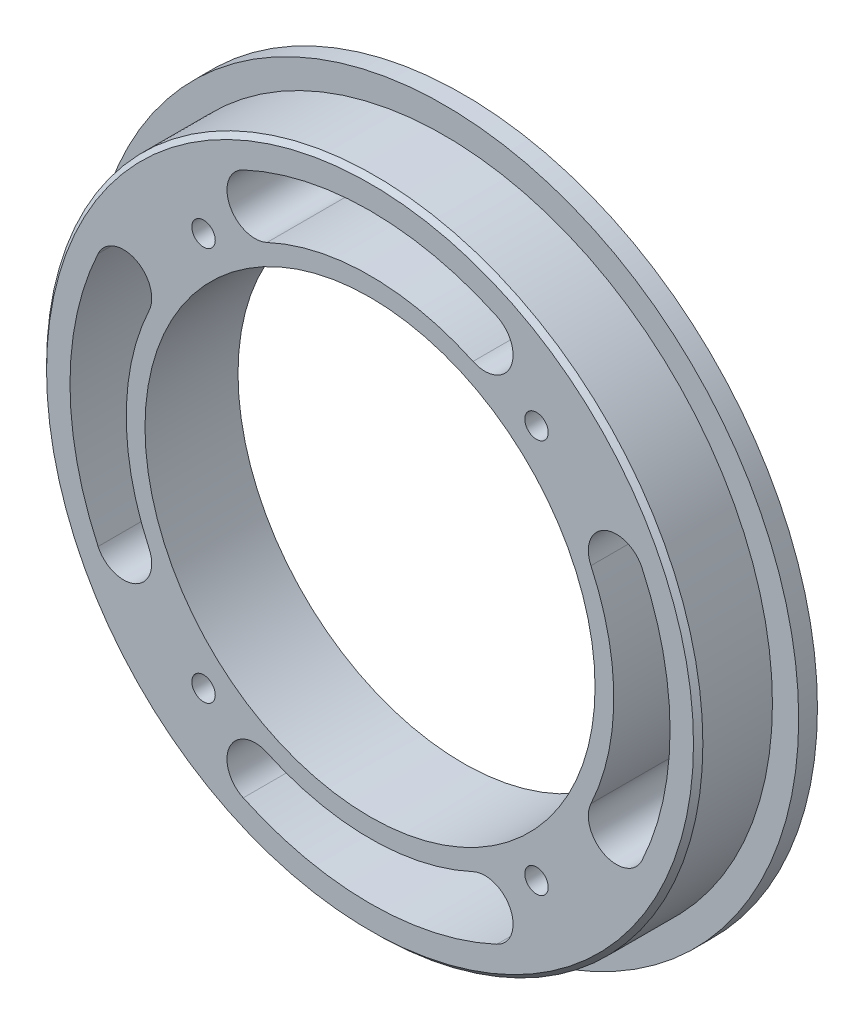
ISO-10303-21;
HEADER;
FILE_DESCRIPTION(('STEP AP214'),'2;1');
FILE_NAME('part.step','',(''),(''),'','','');
FILE_SCHEMA(('AUTOMOTIVE_DESIGN { 1 0 10303 214 1 1 1 1 }'));
ENDSEC;
DATA;
#1=APPLICATION_CONTEXT('core data for automotive mechanical design processes');
#2=APPLICATION_PROTOCOL_DEFINITION('international standard','automotive_design',2000,#1);
#3=PRODUCT_CONTEXT('',#1,'mechanical');
#4=PRODUCT('Part','Part','',(#3));
#5=PRODUCT_RELATED_PRODUCT_CATEGORY('part','',(#4));
#6=PRODUCT_DEFINITION_FORMATION('','',#4);
#7=PRODUCT_DEFINITION_CONTEXT('part definition',#1,'design');
#8=PRODUCT_DEFINITION('design','',#6,#7);
#9=PRODUCT_DEFINITION_SHAPE('','',#8);
#10=(LENGTH_UNIT() NAMED_UNIT(*) SI_UNIT(.MILLI.,.METRE.));
#11=(NAMED_UNIT(*) PLANE_ANGLE_UNIT() SI_UNIT($,.RADIAN.));
#12=(NAMED_UNIT(*) SI_UNIT($,.STERADIAN.) SOLID_ANGLE_UNIT());
#13=UNCERTAINTY_MEASURE_WITH_UNIT(LENGTH_MEASURE(1.E-05),#10,'distance_accuracy_value','');
#14=(GEOMETRIC_REPRESENTATION_CONTEXT(3) GLOBAL_UNCERTAINTY_ASSIGNED_CONTEXT((#13)) GLOBAL_UNIT_ASSIGNED_CONTEXT((#10,
#11,#12)) REPRESENTATION_CONTEXT('',''));
#15=CARTESIAN_POINT('',(0.,0.,0.));
#16=DIRECTION('',(0.,0.,1.));
#17=DIRECTION('',(1.,0.,0.));
#18=AXIS2_PLACEMENT_3D('',#15,#16,#17);
#19=CARTESIAN_POINT('',(0.,0.,-2.));
#20=DIRECTION('',(0.,0.,-1.));
#21=DIRECTION('',(-1.,0.,0.));
#22=AXIS2_PLACEMENT_3D('',#19,#20,#21);
#23=PLANE('',#22);
#24=CARTESIAN_POINT('',(0.,0.,-2.));
#25=DIRECTION('',(0.,0.,-1.));
#26=DIRECTION('',(-1.,0.,0.));
#27=AXIS2_PLACEMENT_3D('',#24,#25,#26);
#28=CIRCLE('',#27,32.);
#29=CARTESIAN_POINT('',(29.0018491851729,-13.5237843757022,-2.));
#30=VERTEX_POINT('',#29);
#31=CARTESIAN_POINT('',(29.0018491851729,13.5237843757022,-2.));
#32=VERTEX_POINT('',#31);
#33=EDGE_CURVE('E169',#30,#32,#28,.F.);
#34=ORIENTED_EDGE('',*,*,#33,.T.);
#35=CARTESIAN_POINT('',(26.2829258240629,12.2559295904801,-2.));
#36=DIRECTION('',(0.,0.,-1.));
#37=DIRECTION('',(-1.,0.,0.));
#38=AXIS2_PLACEMENT_3D('',#35,#36,#37);
#39=CIRCLE('',#38,3.);
#40=CARTESIAN_POINT('',(23.564002462953,10.988074805258,-2.));
#41=VERTEX_POINT('',#40);
#42=EDGE_CURVE('E156',#32,#41,#39,.F.);
#43=ORIENTED_EDGE('',*,*,#42,.T.);
#44=CARTESIAN_POINT('',(0.,0.,-2.));
#45=DIRECTION('',(0.,0.,-1.));
#46=DIRECTION('',(-1.,0.,0.));
#47=AXIS2_PLACEMENT_3D('',#44,#45,#46);
#48=CIRCLE('',#47,26.);
#49=CARTESIAN_POINT('',(23.564002462953,-10.9880748052581,-2.));
#50=VERTEX_POINT('',#49);
#51=EDGE_CURVE('E187',#41,#50,#48,.T.);
#52=ORIENTED_EDGE('',*,*,#51,.T.);
#53=CARTESIAN_POINT('',(26.2829258240629,-12.2559295904801,-2.));
#54=DIRECTION('',(0.,0.,-1.));
#55=DIRECTION('',(-1.,0.,0.));
#56=AXIS2_PLACEMENT_3D('',#53,#54,#55);
#57=CIRCLE('',#56,3.);
#58=EDGE_CURVE('E176',#50,#30,#57,.F.);
#59=ORIENTED_EDGE('',*,*,#58,.T.);
#60=EDGE_LOOP('',(#34,#43,#52,#59));
#61=FACE_BOUND('',#60,.T.);
#62=CARTESIAN_POINT('',(0.,0.,-2.));
#63=DIRECTION('',(0.,0.,-1.));
#64=DIRECTION('',(-1.,0.,0.));
#65=AXIS2_PLACEMENT_3D('',#62,#63,#64);
#66=CIRCLE('',#65,32.);
#67=CARTESIAN_POINT('',(-13.5237843757022,-29.0018491851729,-2.));
#68=VERTEX_POINT('',#67);
#69=CARTESIAN_POINT('',(13.5237843757022,-29.0018491851729,-2.));
#70=VERTEX_POINT('',#69);
#71=EDGE_CURVE('E196',#68,#70,#66,.F.);
#72=ORIENTED_EDGE('',*,*,#71,.T.);
#73=CARTESIAN_POINT('',(12.2559295904801,-26.2829258240629,-2.));
#74=DIRECTION('',(0.,0.,-1.));
#75=DIRECTION('',(-1.,0.,0.));
#76=AXIS2_PLACEMENT_3D('',#73,#74,#75);
#77=CIRCLE('',#76,3.);
#78=CARTESIAN_POINT('',(10.988074805258,-23.564002462953,-2.));
#79=VERTEX_POINT('',#78);
#80=EDGE_CURVE('E217',#70,#79,#77,.F.);
#81=ORIENTED_EDGE('',*,*,#80,.T.);
#82=CARTESIAN_POINT('',(0.,0.,-2.));
#83=DIRECTION('',(0.,0.,-1.));
#84=DIRECTION('',(-1.,0.,0.));
#85=AXIS2_PLACEMENT_3D('',#82,#83,#84);
#86=CIRCLE('',#85,26.);
#87=CARTESIAN_POINT('',(-10.9880748052581,-23.5640024629529,-2.));
#88=VERTEX_POINT('',#87);
#89=EDGE_CURVE('E213',#79,#88,#86,.T.);
#90=ORIENTED_EDGE('',*,*,#89,.T.);
#91=CARTESIAN_POINT('',(-12.2559295904801,-26.2829258240629,-2.));
#92=DIRECTION('',(0.,0.,-1.));
#93=DIRECTION('',(-1.,0.,0.));
#94=AXIS2_PLACEMENT_3D('',#91,#92,#93);
#95=CIRCLE('',#94,3.);
#96=EDGE_CURVE('E209',#88,#68,#95,.F.);
#97=ORIENTED_EDGE('',*,*,#96,.T.);
#98=EDGE_LOOP('',(#72,#81,#90,#97));
#99=FACE_BOUND('',#98,.T.);
#100=CARTESIAN_POINT('',(0.,0.,-2.));
#101=DIRECTION('',(0.,0.,-1.));
#102=DIRECTION('',(-1.,0.,0.));
#103=AXIS2_PLACEMENT_3D('',#100,#101,#102);
#104=CIRCLE('',#103,32.);
#105=CARTESIAN_POINT('',(-29.0018491851729,13.5237843757022,-2.));
#106=VERTEX_POINT('',#105);
#107=CARTESIAN_POINT('',(-29.0018491851729,-13.5237843757022,-2.));
#108=VERTEX_POINT('',#107);
#109=EDGE_CURVE('E227',#106,#108,#104,.F.);
#110=ORIENTED_EDGE('',*,*,#109,.T.);
#111=CARTESIAN_POINT('',(-26.2829258240629,-12.2559295904801,-2.));
#112=DIRECTION('',(0.,0.,-1.));
#113=DIRECTION('',(-1.,0.,0.));
#114=AXIS2_PLACEMENT_3D('',#111,#112,#113);
#115=CIRCLE('',#114,3.);
#116=CARTESIAN_POINT('',(-23.564002462953,-10.9880748052579,-2.));
#117=VERTEX_POINT('',#116);
#118=EDGE_CURVE('E249',#108,#117,#115,.F.);
#119=ORIENTED_EDGE('',*,*,#118,.T.);
#120=CARTESIAN_POINT('',(0.,0.,-2.));
#121=DIRECTION('',(0.,0.,-1.));
#122=DIRECTION('',(-1.,0.,0.));
#123=AXIS2_PLACEMENT_3D('',#120,#121,#122);
#124=CIRCLE('',#123,26.);
#125=CARTESIAN_POINT('',(-23.5640024629529,10.9880748052582,-2.));
#126=VERTEX_POINT('',#125);
#127=EDGE_CURVE('E245',#117,#126,#124,.T.);
#128=ORIENTED_EDGE('',*,*,#127,.T.);
#129=CARTESIAN_POINT('',(-26.2829258240629,12.2559295904801,-2.));
#130=DIRECTION('',(0.,0.,-1.));
#131=DIRECTION('',(-1.,0.,0.));
#132=AXIS2_PLACEMENT_3D('',#129,#130,#131);
#133=CIRCLE('',#132,3.00000000000001);
#134=EDGE_CURVE('E241',#126,#106,#133,.F.);
#135=ORIENTED_EDGE('',*,*,#134,.T.);
#136=EDGE_LOOP('',(#110,#119,#128,#135));
#137=FACE_BOUND('',#136,.T.);
#138=CARTESIAN_POINT('',(0.,0.,-2.));
#139=DIRECTION('',(0.,0.,-1.));
#140=DIRECTION('',(-1.,0.,0.));
#141=AXIS2_PLACEMENT_3D('',#138,#139,#140);
#142=CIRCLE('',#141,32.);
#143=CARTESIAN_POINT('',(13.5237843757022,29.0018491851729,-2.));
#144=VERTEX_POINT('',#143);
#145=CARTESIAN_POINT('',(-13.5237843757022,29.0018491851729,-2.));
#146=VERTEX_POINT('',#145);
#147=EDGE_CURVE('E259',#144,#146,#142,.F.);
#148=ORIENTED_EDGE('',*,*,#147,.T.);
#149=CARTESIAN_POINT('',(-12.2559295904801,26.2829258240629,-2.));
#150=DIRECTION('',(0.,0.,-1.));
#151=DIRECTION('',(-1.,0.,0.));
#152=AXIS2_PLACEMENT_3D('',#149,#150,#151);
#153=CIRCLE('',#152,3.);
#154=CARTESIAN_POINT('',(-10.9880748052578,23.5640024629531,-2.));
#155=VERTEX_POINT('',#154);
#156=EDGE_CURVE('E280',#146,#155,#153,.F.);
#157=ORIENTED_EDGE('',*,*,#156,.T.);
#158=CARTESIAN_POINT('',(0.,0.,-2.));
#159=DIRECTION('',(0.,0.,-1.));
#160=DIRECTION('',(-1.,0.,0.));
#161=AXIS2_PLACEMENT_3D('',#158,#159,#160);
#162=CIRCLE('',#161,26.);
#163=CARTESIAN_POINT('',(10.9880748052583,23.5640024629529,-2.));
#164=VERTEX_POINT('',#163);
#165=EDGE_CURVE('E276',#155,#164,#162,.T.);
#166=ORIENTED_EDGE('',*,*,#165,.T.);
#167=CARTESIAN_POINT('',(12.2559295904801,26.2829258240629,-2.));
#168=DIRECTION('',(0.,0.,-1.));
#169=DIRECTION('',(-1.,0.,0.));
#170=AXIS2_PLACEMENT_3D('',#167,#168,#169);
#171=CIRCLE('',#170,3.);
#172=EDGE_CURVE('E272',#164,#144,#171,.F.);
#173=ORIENTED_EDGE('',*,*,#172,.T.);
#174=EDGE_LOOP('',(#148,#157,#166,#173));
#175=FACE_BOUND('',#174,.T.);
#176=CARTESIAN_POINT('',(0.,0.,-2.));
#177=DIRECTION('',(0.,0.,-1.));
#178=DIRECTION('',(-1.,0.,0.));
#179=AXIS2_PLACEMENT_3D('',#176,#177,#178);
#180=CIRCLE('',#179,24.);
#181=CARTESIAN_POINT('',(-24.,0.,-2.));
#182=VERTEX_POINT('',#181);
#183=EDGE_CURVE('E311',#182,#182,#180,.T.);
#184=ORIENTED_EDGE('',*,*,#183,.F.);
#185=EDGE_LOOP('',(#184));
#186=FACE_BOUND('',#185,.T.);
#187=CARTESIAN_POINT('',(0.,0.,-2.));
#188=DIRECTION('',(0.,0.,-1.));
#189=DIRECTION('',(-1.,0.,0.));
#190=AXIS2_PLACEMENT_3D('',#187,#188,#189);
#191=CIRCLE('',#190,37.8);
#192=CARTESIAN_POINT('',(-37.8,0.,-2.));
#193=VERTEX_POINT('',#192);
#194=EDGE_CURVE('E315',#193,#193,#191,.T.);
#195=ORIENTED_EDGE('',*,*,#194,.T.);
#196=EDGE_LOOP('',(#195));
#197=FACE_BOUND('',#196,.T.);
#198=CARTESIAN_POINT('',(17.7552809045647,21.,-2.));
#199=DIRECTION('',(0.,0.,1.));
#200=DIRECTION('',(1.,0.,0.));
#201=AXIS2_PLACEMENT_3D('',#198,#199,#200);
#202=CIRCLE('',#201,1.25);
#203=CARTESIAN_POINT('',(19.0052809045647,21.,-2.));
#204=VERTEX_POINT('',#203);
#205=EDGE_CURVE('E308',#204,#204,#202,.T.);
#206=ORIENTED_EDGE('',*,*,#205,.T.);
#207=EDGE_LOOP('',(#206));
#208=FACE_BOUND('',#207,.T.);
#209=CARTESIAN_POINT('',(17.7552809045647,-21.,-2.));
#210=DIRECTION('',(0.,0.,1.));
#211=DIRECTION('',(1.,0.,0.));
#212=AXIS2_PLACEMENT_3D('',#209,#210,#211);
#213=CIRCLE('',#212,1.25);
#214=CARTESIAN_POINT('',(19.0052809045647,-21.,-2.));
#215=VERTEX_POINT('',#214);
#216=EDGE_CURVE('E302',#215,#215,#213,.T.);
#217=ORIENTED_EDGE('',*,*,#216,.T.);
#218=EDGE_LOOP('',(#217));
#219=FACE_BOUND('',#218,.T.);
#220=CARTESIAN_POINT('',(-17.7552809045647,-21.,-2.));
#221=DIRECTION('',(0.,0.,1.));
#222=DIRECTION('',(1.,0.,0.));
#223=AXIS2_PLACEMENT_3D('',#220,#221,#222);
#224=CIRCLE('',#223,1.25);
#225=CARTESIAN_POINT('',(-16.5052809045647,-21.,-2.));
#226=VERTEX_POINT('',#225);
#227=EDGE_CURVE('E296',#226,#226,#224,.T.);
#228=ORIENTED_EDGE('',*,*,#227,.T.);
#229=EDGE_LOOP('',(#228));
#230=FACE_BOUND('',#229,.T.);
#231=CARTESIAN_POINT('',(-17.7552809045647,21.,-2.));
#232=DIRECTION('',(0.,0.,1.));
#233=DIRECTION('',(1.,0.,0.));
#234=AXIS2_PLACEMENT_3D('',#231,#232,#233);
#235=CIRCLE('',#234,1.25);
#236=CARTESIAN_POINT('',(-16.5052809045647,21.,-2.));
#237=VERTEX_POINT('',#236);
#238=EDGE_CURVE('E290',#237,#237,#235,.T.);
#239=ORIENTED_EDGE('',*,*,#238,.T.);
#240=EDGE_LOOP('',(#239));
#241=FACE_BOUND('',#240,.T.);
#242=ADVANCED_FACE('F42',(#61,#99,#137,#175,#186,#197,#208,#219,#230,#241),#23,.T.);
#243=CARTESIAN_POINT('',(0.,0.,7.92));
#244=DIRECTION('',(0.,0.,1.));
#245=DIRECTION('',(1.,0.,0.));
#246=AXIS2_PLACEMENT_3D('',#243,#244,#245);
#247=PLANE('',#246);
#248=CARTESIAN_POINT('',(0.,0.,7.92));
#249=DIRECTION('',(0.,0.,1.));
#250=DIRECTION('',(1.,0.,0.));
#251=AXIS2_PLACEMENT_3D('',#248,#249,#250);
#252=CIRCLE('',#251,32.);
#253=CARTESIAN_POINT('',(29.0018491851729,-13.5237843757022,7.92));
#254=VERTEX_POINT('',#253);
#255=CARTESIAN_POINT('',(29.0018491851729,13.5237843757022,7.92));
#256=VERTEX_POINT('',#255);
#257=EDGE_CURVE('E172',#254,#256,#252,.T.);
#258=ORIENTED_EDGE('',*,*,#257,.F.);
#259=CARTESIAN_POINT('',(26.2829258240629,-12.2559295904801,7.92));
#260=DIRECTION('',(0.,0.,1.));
#261=DIRECTION('',(1.,0.,0.));
#262=AXIS2_PLACEMENT_3D('',#259,#260,#261);
#263=CIRCLE('',#262,3.);
#264=CARTESIAN_POINT('',(23.564002462953,-10.9880748052581,7.92));
#265=VERTEX_POINT('',#264);
#266=EDGE_CURVE('E183',#265,#254,#263,.T.);
#267=ORIENTED_EDGE('',*,*,#266,.F.);
#268=CARTESIAN_POINT('',(0.,0.,7.92));
#269=DIRECTION('',(0.,0.,-1.));
#270=DIRECTION('',(1.,0.,0.));
#271=AXIS2_PLACEMENT_3D('',#268,#269,#270);
#272=CIRCLE('',#271,26.);
#273=CARTESIAN_POINT('',(23.564002462953,10.988074805258,7.92));
#274=VERTEX_POINT('',#273);
#275=EDGE_CURVE('E177',#274,#265,#272,.T.);
#276=ORIENTED_EDGE('',*,*,#275,.F.);
#277=CARTESIAN_POINT('',(26.2829258240629,12.2559295904801,7.92));
#278=DIRECTION('',(0.,0.,1.));
#279=DIRECTION('',(1.,0.,0.));
#280=AXIS2_PLACEMENT_3D('',#277,#278,#279);
#281=CIRCLE('',#280,3.);
#282=EDGE_CURVE('E179',#256,#274,#281,.T.);
#283=ORIENTED_EDGE('',*,*,#282,.F.);
#284=EDGE_LOOP('',(#258,#267,#276,#283));
#285=FACE_BOUND('',#284,.T.);
#286=CARTESIAN_POINT('',(0.,0.,7.92));
#287=DIRECTION('',(0.,0.,1.));
#288=DIRECTION('',(1.,0.,0.));
#289=AXIS2_PLACEMENT_3D('',#286,#287,#288);
#290=CIRCLE('',#289,32.);
#291=CARTESIAN_POINT('',(-13.5237843757022,-29.0018491851729,7.92));
#292=VERTEX_POINT('',#291);
#293=CARTESIAN_POINT('',(13.5237843757022,-29.0018491851729,7.92));
#294=VERTEX_POINT('',#293);
#295=EDGE_CURVE('E200',#292,#294,#290,.T.);
#296=ORIENTED_EDGE('',*,*,#295,.F.);
#297=CARTESIAN_POINT('',(-12.2559295904801,-26.2829258240629,7.92));
#298=DIRECTION('',(0.,0.,1.));
#299=DIRECTION('',(1.,0.,0.));
#300=AXIS2_PLACEMENT_3D('',#297,#298,#299);
#301=CIRCLE('',#300,3.);
#302=CARTESIAN_POINT('',(-10.9880748052581,-23.5640024629529,7.92));
#303=VERTEX_POINT('',#302);
#304=EDGE_CURVE('E203',#303,#292,#301,.T.);
#305=ORIENTED_EDGE('',*,*,#304,.F.);
#306=CARTESIAN_POINT('',(0.,0.,7.92));
#307=DIRECTION('',(0.,0.,-1.));
#308=DIRECTION('',(1.,0.,0.));
#309=AXIS2_PLACEMENT_3D('',#306,#307,#308);
#310=CIRCLE('',#309,26.);
#311=CARTESIAN_POINT('',(10.988074805258,-23.564002462953,7.92));
#312=VERTEX_POINT('',#311);
#313=EDGE_CURVE('E194',#312,#303,#310,.T.);
#314=ORIENTED_EDGE('',*,*,#313,.F.);
#315=CARTESIAN_POINT('',(12.2559295904801,-26.2829258240629,7.92));
#316=DIRECTION('',(0.,0.,1.));
#317=DIRECTION('',(1.,0.,0.));
#318=AXIS2_PLACEMENT_3D('',#315,#316,#317);
#319=CIRCLE('',#318,3.);
#320=EDGE_CURVE('E197',#294,#312,#319,.T.);
#321=ORIENTED_EDGE('',*,*,#320,.F.);
#322=EDGE_LOOP('',(#296,#305,#314,#321));
#323=FACE_BOUND('',#322,.T.);
#324=CARTESIAN_POINT('',(0.,0.,7.92));
#325=DIRECTION('',(0.,0.,1.));
#326=DIRECTION('',(1.,0.,0.));
#327=AXIS2_PLACEMENT_3D('',#324,#325,#326);
#328=CIRCLE('',#327,32.);
#329=CARTESIAN_POINT('',(-29.0018491851729,13.5237843757022,7.92));
#330=VERTEX_POINT('',#329);
#331=CARTESIAN_POINT('',(-29.0018491851729,-13.5237843757022,7.92));
#332=VERTEX_POINT('',#331);
#333=EDGE_CURVE('E231',#330,#332,#328,.T.);
#334=ORIENTED_EDGE('',*,*,#333,.F.);
#335=CARTESIAN_POINT('',(-26.2829258240629,12.2559295904801,7.92));
#336=DIRECTION('',(0.,0.,1.));
#337=DIRECTION('',(1.,0.,0.));
#338=AXIS2_PLACEMENT_3D('',#335,#336,#337);
#339=CIRCLE('',#338,3.00000000000001);
#340=CARTESIAN_POINT('',(-23.5640024629529,10.9880748052582,7.92));
#341=VERTEX_POINT('',#340);
#342=EDGE_CURVE('E234',#341,#330,#339,.T.);
#343=ORIENTED_EDGE('',*,*,#342,.F.);
#344=CARTESIAN_POINT('',(0.,0.,7.92));
#345=DIRECTION('',(0.,0.,-1.));
#346=DIRECTION('',(1.,0.,0.));
#347=AXIS2_PLACEMENT_3D('',#344,#345,#346);
#348=CIRCLE('',#347,26.);
#349=CARTESIAN_POINT('',(-23.564002462953,-10.9880748052579,7.92));
#350=VERTEX_POINT('',#349);
#351=EDGE_CURVE('E225',#350,#341,#348,.T.);
#352=ORIENTED_EDGE('',*,*,#351,.F.);
#353=CARTESIAN_POINT('',(-26.2829258240629,-12.2559295904801,7.92));
#354=DIRECTION('',(0.,0.,1.));
#355=DIRECTION('',(1.,0.,0.));
#356=AXIS2_PLACEMENT_3D('',#353,#354,#355);
#357=CIRCLE('',#356,3.);
#358=EDGE_CURVE('E228',#332,#350,#357,.T.);
#359=ORIENTED_EDGE('',*,*,#358,.F.);
#360=EDGE_LOOP('',(#334,#343,#352,#359));
#361=FACE_BOUND('',#360,.T.);
#362=CARTESIAN_POINT('',(0.,0.,7.92));
#363=DIRECTION('',(0.,0.,1.));
#364=DIRECTION('',(1.,0.,0.));
#365=AXIS2_PLACEMENT_3D('',#362,#363,#364);
#366=CIRCLE('',#365,32.);
#367=CARTESIAN_POINT('',(13.5237843757022,29.0018491851729,7.92));
#368=VERTEX_POINT('',#367);
#369=CARTESIAN_POINT('',(-13.5237843757022,29.0018491851729,7.92));
#370=VERTEX_POINT('',#369);
#371=EDGE_CURVE('E263',#368,#370,#366,.T.);
#372=ORIENTED_EDGE('',*,*,#371,.F.);
#373=CARTESIAN_POINT('',(12.2559295904801,26.2829258240629,7.92));
#374=DIRECTION('',(0.,0.,1.));
#375=DIRECTION('',(1.,0.,0.));
#376=AXIS2_PLACEMENT_3D('',#373,#374,#375);
#377=CIRCLE('',#376,3.);
#378=CARTESIAN_POINT('',(10.9880748052583,23.5640024629528,7.92));
#379=VERTEX_POINT('',#378);
#380=EDGE_CURVE('E266',#379,#368,#377,.T.);
#381=ORIENTED_EDGE('',*,*,#380,.F.);
#382=CARTESIAN_POINT('',(0.,0.,7.92));
#383=DIRECTION('',(0.,0.,-1.));
#384=DIRECTION('',(1.,0.,0.));
#385=AXIS2_PLACEMENT_3D('',#382,#383,#384);
#386=CIRCLE('',#385,26.);
#387=CARTESIAN_POINT('',(-10.9880748052578,23.5640024629531,7.92));
#388=VERTEX_POINT('',#387);
#389=EDGE_CURVE('E257',#388,#379,#386,.T.);
#390=ORIENTED_EDGE('',*,*,#389,.F.);
#391=CARTESIAN_POINT('',(-12.2559295904801,26.2829258240629,7.92));
#392=DIRECTION('',(0.,0.,1.));
#393=DIRECTION('',(1.,0.,0.));
#394=AXIS2_PLACEMENT_3D('',#391,#392,#393);
#395=CIRCLE('',#394,3.);
#396=EDGE_CURVE('E260',#370,#388,#395,.T.);
#397=ORIENTED_EDGE('',*,*,#396,.F.);
#398=EDGE_LOOP('',(#372,#381,#390,#397));
#399=FACE_BOUND('',#398,.T.);
#400=CARTESIAN_POINT('',(0.,0.,7.92));
#401=DIRECTION('',(0.,0.,1.));
#402=DIRECTION('',(1.,0.,0.));
#403=AXIS2_PLACEMENT_3D('',#400,#401,#402);
#404=CIRCLE('',#403,34.5);
#405=CARTESIAN_POINT('',(34.5,0.,7.92));
#406=VERTEX_POINT('',#405);
#407=EDGE_CURVE('E51',#406,#406,#404,.T.);
#408=ORIENTED_EDGE('',*,*,#407,.T.);
#409=EDGE_LOOP('',(#408));
#410=FACE_BOUND('',#409,.T.);
#411=CARTESIAN_POINT('',(-17.7552809045647,21.,7.92));
#412=DIRECTION('',(0.,0.,1.));
#413=DIRECTION('',(1.,0.,0.));
#414=AXIS2_PLACEMENT_3D('',#411,#412,#413);
#415=CIRCLE('',#414,1.25);
#416=CARTESIAN_POINT('',(-16.5052809045647,21.,7.92));
#417=VERTEX_POINT('',#416);
#418=EDGE_CURVE('E193',#417,#417,#415,.T.);
#419=ORIENTED_EDGE('',*,*,#418,.F.);
#420=EDGE_LOOP('',(#419));
#421=FACE_BOUND('',#420,.T.);
#422=CARTESIAN_POINT('',(-17.7552809045647,-21.,7.92));
#423=DIRECTION('',(0.,0.,1.));
#424=DIRECTION('',(1.,0.,0.));
#425=AXIS2_PLACEMENT_3D('',#422,#423,#424);
#426=CIRCLE('',#425,1.25);
#427=CARTESIAN_POINT('',(-16.5052809045647,-21.,7.92));
#428=VERTEX_POINT('',#427);
#429=EDGE_CURVE('E293',#428,#428,#426,.T.);
#430=ORIENTED_EDGE('',*,*,#429,.F.);
#431=EDGE_LOOP('',(#430));
#432=FACE_BOUND('',#431,.T.);
#433=CARTESIAN_POINT('',(17.7552809045647,-21.,7.92));
#434=DIRECTION('',(0.,0.,1.));
#435=DIRECTION('',(1.,0.,0.));
#436=AXIS2_PLACEMENT_3D('',#433,#434,#435);
#437=CIRCLE('',#436,1.25);
#438=CARTESIAN_POINT('',(19.0052809045647,-21.,7.92));
#439=VERTEX_POINT('',#438);
#440=EDGE_CURVE('E299',#439,#439,#437,.T.);
#441=ORIENTED_EDGE('',*,*,#440,.F.);
#442=EDGE_LOOP('',(#441));
#443=FACE_BOUND('',#442,.T.);
#444=CARTESIAN_POINT('',(17.7552809045647,21.,7.92));
#445=DIRECTION('',(0.,0.,1.));
#446=DIRECTION('',(1.,0.,0.));
#447=AXIS2_PLACEMENT_3D('',#444,#445,#446);
#448=CIRCLE('',#447,1.25);
#449=CARTESIAN_POINT('',(19.0052809045647,21.,7.92));
#450=VERTEX_POINT('',#449);
#451=EDGE_CURVE('E305',#450,#450,#448,.T.);
#452=ORIENTED_EDGE('',*,*,#451,.F.);
#453=EDGE_LOOP('',(#452));
#454=FACE_BOUND('',#453,.T.);
#455=CARTESIAN_POINT('',(0.,0.,7.92));
#456=DIRECTION('',(0.,0.,1.));
#457=DIRECTION('',(1.,0.,0.));
#458=AXIS2_PLACEMENT_3D('',#455,#456,#457);
#459=CIRCLE('',#458,24.);
#460=CARTESIAN_POINT('',(24.,0.,7.92));
#461=VERTEX_POINT('',#460);
#462=EDGE_CURVE('E321',#461,#461,#459,.T.);
#463=ORIENTED_EDGE('',*,*,#462,.F.);
#464=EDGE_LOOP('',(#463));
#465=FACE_BOUND('',#464,.T.);
#466=ADVANCED_FACE('F328',(#285,#323,#361,#399,#410,#421,#432,#443,#454,#465),#247,.T.);
#467=CARTESIAN_POINT('',(0.,0.,7.92));
#468=DIRECTION('',(0.,0.,-1.));
#469=DIRECTION('',(-1.,0.,0.));
#470=AXIS2_PLACEMENT_3D('',#467,#468,#469);
#471=CYLINDRICAL_SURFACE('',#470,35.);
#472=CARTESIAN_POINT('',(0.,0.,7.42000000000001));
#473=DIRECTION('',(0.,0.,1.));
#474=DIRECTION('',(1.,0.,0.));
#475=AXIS2_PLACEMENT_3D('',#472,#473,#474);
#476=CIRCLE('',#475,35.);
#477=CARTESIAN_POINT('',(35.,0.,7.42000000000001));
#478=VERTEX_POINT('',#477);
#479=EDGE_CURVE('E11',#478,#478,#476,.F.);
#480=ORIENTED_EDGE('',*,*,#479,.T.);
#481=EDGE_LOOP('',(#480));
#482=FACE_BOUND('',#481,.T.);
#483=CARTESIAN_POINT('',(0.,0.,0.));
#484=DIRECTION('',(0.,0.,1.));
#485=DIRECTION('',(1.,0.,0.));
#486=AXIS2_PLACEMENT_3D('',#483,#484,#485);
#487=CIRCLE('',#486,35.);
#488=CARTESIAN_POINT('',(35.,0.,0.));
#489=VERTEX_POINT('',#488);
#490=EDGE_CURVE('E318',#489,#489,#487,.T.);
#491=ORIENTED_EDGE('',*,*,#490,.T.);
#492=EDGE_LOOP('',(#491));
#493=FACE_BOUND('',#492,.T.);
#494=ADVANCED_FACE('F351',(#482,#493),#471,.T.);
#495=CARTESIAN_POINT('',(0.,0.,7.92));
#496=DIRECTION('',(0.,0.,-1.));
#497=DIRECTION('',(-1.,0.,0.));
#498=AXIS2_PLACEMENT_3D('',#495,#496,#497);
#499=CYLINDRICAL_SURFACE('',#498,24.);
#500=ORIENTED_EDGE('',*,*,#462,.T.);
#501=EDGE_LOOP('',(#500));
#502=FACE_BOUND('',#501,.T.);
#503=ORIENTED_EDGE('',*,*,#183,.T.);
#504=EDGE_LOOP('',(#503));
#505=FACE_BOUND('',#504,.T.);
#506=ADVANCED_FACE('F362',(#502,#505),#499,.F.);
#507=CARTESIAN_POINT('',(0.,0.,0.));
#508=DIRECTION('',(0.,0.,-1.));
#509=DIRECTION('',(-1.,0.,0.));
#510=AXIS2_PLACEMENT_3D('',#507,#508,#509);
#511=PLANE('',#510);
#512=ORIENTED_EDGE('',*,*,#490,.F.);
#513=EDGE_LOOP('',(#512));
#514=FACE_BOUND('',#513,.T.);
#515=CARTESIAN_POINT('',(0.,0.,0.));
#516=DIRECTION('',(0.,0.,-1.));
#517=DIRECTION('',(-1.,0.,0.));
#518=AXIS2_PLACEMENT_3D('',#515,#516,#517);
#519=CIRCLE('',#518,37.8);
#520=CARTESIAN_POINT('',(-37.8,0.,0.));
#521=VERTEX_POINT('',#520);
#522=EDGE_CURVE('E314',#521,#521,#519,.T.);
#523=ORIENTED_EDGE('',*,*,#522,.F.);
#524=EDGE_LOOP('',(#523));
#525=FACE_BOUND('',#524,.T.);
#526=ADVANCED_FACE('F358',(#514,#525),#511,.F.);
#527=CARTESIAN_POINT('',(0.,0.,-2.));
#528=DIRECTION('',(0.,0.,1.));
#529=DIRECTION('',(1.,0.,0.));
#530=AXIS2_PLACEMENT_3D('',#527,#528,#529);
#531=CYLINDRICAL_SURFACE('',#530,37.8);
#532=ORIENTED_EDGE('',*,*,#194,.F.);
#533=EDGE_LOOP('',(#532));
#534=FACE_BOUND('',#533,.T.);
#535=ORIENTED_EDGE('',*,*,#522,.T.);
#536=EDGE_LOOP('',(#535));
#537=FACE_BOUND('',#536,.T.);
#538=ADVANCED_FACE('F361',(#534,#537),#531,.T.);
#539=CARTESIAN_POINT('',(17.7552809045647,21.,7.92));
#540=DIRECTION('',(0.,0.,1.));
#541=DIRECTION('',(1.,0.,0.));
#542=AXIS2_PLACEMENT_3D('',#539,#540,#541);
#543=CYLINDRICAL_SURFACE('',#542,1.25);
#544=ORIENTED_EDGE('',*,*,#205,.F.);
#545=EDGE_LOOP('',(#544));
#546=FACE_BOUND('',#545,.T.);
#547=ORIENTED_EDGE('',*,*,#451,.T.);
#548=EDGE_LOOP('',(#547));
#549=FACE_BOUND('',#548,.T.);
#550=ADVANCED_FACE('F356',(#546,#549),#543,.F.);
#551=CARTESIAN_POINT('',(17.7552809045647,-21.,7.92));
#552=DIRECTION('',(0.,0.,1.));
#553=DIRECTION('',(1.,0.,0.));
#554=AXIS2_PLACEMENT_3D('',#551,#552,#553);
#555=CYLINDRICAL_SURFACE('',#554,1.25);
#556=ORIENTED_EDGE('',*,*,#216,.F.);
#557=EDGE_LOOP('',(#556));
#558=FACE_BOUND('',#557,.T.);
#559=ORIENTED_EDGE('',*,*,#440,.T.);
#560=EDGE_LOOP('',(#559));
#561=FACE_BOUND('',#560,.T.);
#562=ADVANCED_FACE('F400',(#558,#561),#555,.F.);
#563=CARTESIAN_POINT('',(-17.7552809045647,-21.,7.92));
#564=DIRECTION('',(0.,0.,1.));
#565=DIRECTION('',(1.,0.,0.));
#566=AXIS2_PLACEMENT_3D('',#563,#564,#565);
#567=CYLINDRICAL_SURFACE('',#566,1.25);
#568=ORIENTED_EDGE('',*,*,#227,.F.);
#569=EDGE_LOOP('',(#568));
#570=FACE_BOUND('',#569,.T.);
#571=ORIENTED_EDGE('',*,*,#429,.T.);
#572=EDGE_LOOP('',(#571));
#573=FACE_BOUND('',#572,.T.);
#574=ADVANCED_FACE('F342',(#570,#573),#567,.F.);
#575=CARTESIAN_POINT('',(-17.7552809045647,21.,7.92));
#576=DIRECTION('',(0.,0.,1.));
#577=DIRECTION('',(1.,0.,0.));
#578=AXIS2_PLACEMENT_3D('',#575,#576,#577);
#579=CYLINDRICAL_SURFACE('',#578,1.25);
#580=ORIENTED_EDGE('',*,*,#238,.F.);
#581=EDGE_LOOP('',(#580));
#582=FACE_BOUND('',#581,.T.);
#583=ORIENTED_EDGE('',*,*,#418,.T.);
#584=EDGE_LOOP('',(#583));
#585=FACE_BOUND('',#584,.T.);
#586=ADVANCED_FACE('F333',(#582,#585),#579,.F.);
#587=CARTESIAN_POINT('',(0.,0.,7.92));
#588=DIRECTION('',(0.,0.,-1.));
#589=DIRECTION('',(-1.,0.,0.));
#590=AXIS2_PLACEMENT_3D('',#587,#588,#589);
#591=CONICAL_SURFACE('',#590,34.5,0.785398163397455);
#592=ORIENTED_EDGE('',*,*,#479,.F.);
#593=EDGE_LOOP('',(#592));
#594=FACE_BOUND('',#593,.T.);
#595=ORIENTED_EDGE('',*,*,#407,.F.);
#596=EDGE_LOOP('',(#595));
#597=FACE_BOUND('',#596,.T.);
#598=ADVANCED_FACE('F45',(#594,#597),#591,.T.);
#599=CARTESIAN_POINT('',(0.,0.,-33.7326477443585));
#600=DIRECTION('',(0.,0.,1.));
#601=DIRECTION('',(1.,0.,0.));
#602=AXIS2_PLACEMENT_3D('',#599,#600,#601);
#603=CYLINDRICAL_SURFACE('',#602,32.);
#604=DIRECTION('',(0.,0.,1.));
#605=VECTOR('',#604,1.);
#606=CARTESIAN_POINT('',(13.5237843757022,29.0018491851729,-33.7326477443585));
#607=LINE('',#606,#605);
#608=EDGE_CURVE('E237',#144,#368,#607,.T.);
#609=ORIENTED_EDGE('',*,*,#608,.T.);
#610=ORIENTED_EDGE('',*,*,#371,.T.);
#611=DIRECTION('',(0.,0.,1.));
#612=VECTOR('',#611,1.);
#613=CARTESIAN_POINT('',(-13.5237843757022,29.0018491851729,-33.7326477443585));
#614=LINE('',#613,#612);
#615=EDGE_CURVE('E271',#146,#370,#614,.T.);
#616=ORIENTED_EDGE('',*,*,#615,.F.);
#617=ORIENTED_EDGE('',*,*,#147,.F.);
#618=EDGE_LOOP('',(#609,#610,#616,#617));
#619=FACE_BOUND('',#618,.T.);
#620=ADVANCED_FACE('F332',(#619),#603,.F.);
#621=CARTESIAN_POINT('',(-12.2559295904801,26.2829258240629,-33.7326477443585));
#622=DIRECTION('',(0.,0.,1.));
#623=DIRECTION('',(1.,0.,0.));
#624=AXIS2_PLACEMENT_3D('',#621,#622,#623);
#625=CYLINDRICAL_SURFACE('',#624,3.);
#626=ORIENTED_EDGE('',*,*,#615,.T.);
#627=ORIENTED_EDGE('',*,*,#396,.T.);
#628=DIRECTION('',(0.,0.,1.));
#629=VECTOR('',#628,1.);
#630=CARTESIAN_POINT('',(-10.9880748052578,23.5640024629531,-33.7326477443585));
#631=LINE('',#630,#629);
#632=EDGE_CURVE('E279',#155,#388,#631,.T.);
#633=ORIENTED_EDGE('',*,*,#632,.F.);
#634=ORIENTED_EDGE('',*,*,#156,.F.);
#635=EDGE_LOOP('',(#626,#627,#633,#634));
#636=FACE_BOUND('',#635,.T.);
#637=ADVANCED_FACE('F339',(#636),#625,.F.);
#638=CARTESIAN_POINT('',(0.,0.,-33.7326477443585));
#639=DIRECTION('',(0.,0.,1.));
#640=DIRECTION('',(1.,0.,0.));
#641=AXIS2_PLACEMENT_3D('',#638,#639,#640);
#642=CYLINDRICAL_SURFACE('',#641,26.);
#643=ORIENTED_EDGE('',*,*,#632,.T.);
#644=ORIENTED_EDGE('',*,*,#389,.T.);
#645=DIRECTION('',(0.,0.,1.));
#646=VECTOR('',#645,1.);
#647=CARTESIAN_POINT('',(10.9880748052583,23.5640024629528,-33.7326477443585));
#648=LINE('',#647,#646);
#649=EDGE_CURVE('E275',#164,#379,#648,.T.);
#650=ORIENTED_EDGE('',*,*,#649,.F.);
#651=ORIENTED_EDGE('',*,*,#165,.F.);
#652=EDGE_LOOP('',(#643,#644,#650,#651));
#653=FACE_BOUND('',#652,.T.);
#654=ADVANCED_FACE('F444',(#653),#642,.T.);
#655=CARTESIAN_POINT('',(12.2559295904801,26.2829258240629,-33.7326477443585));
#656=DIRECTION('',(0.,0.,1.));
#657=DIRECTION('',(1.,0.,0.));
#658=AXIS2_PLACEMENT_3D('',#655,#656,#657);
#659=CYLINDRICAL_SURFACE('',#658,3.);
#660=ORIENTED_EDGE('',*,*,#649,.T.);
#661=ORIENTED_EDGE('',*,*,#380,.T.);
#662=ORIENTED_EDGE('',*,*,#608,.F.);
#663=ORIENTED_EDGE('',*,*,#172,.F.);
#664=EDGE_LOOP('',(#660,#661,#662,#663));
#665=FACE_BOUND('',#664,.T.);
#666=ADVANCED_FACE('F454',(#665),#659,.F.);
#667=CARTESIAN_POINT('',(0.,0.,-33.7326477443585));
#668=DIRECTION('',(0.,0.,1.));
#669=DIRECTION('',(1.,0.,0.));
#670=AXIS2_PLACEMENT_3D('',#667,#668,#669);
#671=CYLINDRICAL_SURFACE('',#670,32.);
#672=DIRECTION('',(0.,0.,1.));
#673=VECTOR('',#672,1.);
#674=CARTESIAN_POINT('',(-29.0018491851729,13.5237843757022,-33.7326477443585));
#675=LINE('',#674,#673);
#676=EDGE_CURVE('E205',#106,#330,#675,.T.);
#677=ORIENTED_EDGE('',*,*,#676,.T.);
#678=ORIENTED_EDGE('',*,*,#333,.T.);
#679=DIRECTION('',(0.,0.,1.));
#680=VECTOR('',#679,1.);
#681=CARTESIAN_POINT('',(-29.0018491851729,-13.5237843757022,-33.7326477443585));
#682=LINE('',#681,#680);
#683=EDGE_CURVE('E240',#108,#332,#682,.T.);
#684=ORIENTED_EDGE('',*,*,#683,.F.);
#685=ORIENTED_EDGE('',*,*,#109,.F.);
#686=EDGE_LOOP('',(#677,#678,#684,#685));
#687=FACE_BOUND('',#686,.T.);
#688=ADVANCED_FACE('F464',(#687),#671,.F.);
#689=CARTESIAN_POINT('',(-26.2829258240629,-12.2559295904801,-33.7326477443585));
#690=DIRECTION('',(0.,0.,1.));
#691=DIRECTION('',(1.,0.,0.));
#692=AXIS2_PLACEMENT_3D('',#689,#690,#691);
#693=CYLINDRICAL_SURFACE('',#692,3.);
#694=ORIENTED_EDGE('',*,*,#683,.T.);
#695=ORIENTED_EDGE('',*,*,#358,.T.);
#696=DIRECTION('',(0.,0.,1.));
#697=VECTOR('',#696,1.);
#698=CARTESIAN_POINT('',(-23.564002462953,-10.9880748052579,-33.7326477443585));
#699=LINE('',#698,#697);
#700=EDGE_CURVE('E248',#117,#350,#699,.T.);
#701=ORIENTED_EDGE('',*,*,#700,.F.);
#702=ORIENTED_EDGE('',*,*,#118,.F.);
#703=EDGE_LOOP('',(#694,#695,#701,#702));
#704=FACE_BOUND('',#703,.T.);
#705=ADVANCED_FACE('F474',(#704),#693,.F.);
#706=CARTESIAN_POINT('',(0.,0.,-33.7326477443585));
#707=DIRECTION('',(0.,0.,1.));
#708=DIRECTION('',(1.,0.,0.));
#709=AXIS2_PLACEMENT_3D('',#706,#707,#708);
#710=CYLINDRICAL_SURFACE('',#709,26.);
#711=ORIENTED_EDGE('',*,*,#700,.T.);
#712=ORIENTED_EDGE('',*,*,#351,.T.);
#713=DIRECTION('',(0.,0.,1.));
#714=VECTOR('',#713,1.);
#715=CARTESIAN_POINT('',(-23.5640024629529,10.9880748052582,-33.7326477443585));
#716=LINE('',#715,#714);
#717=EDGE_CURVE('E244',#126,#341,#716,.T.);
#718=ORIENTED_EDGE('',*,*,#717,.F.);
#719=ORIENTED_EDGE('',*,*,#127,.F.);
#720=EDGE_LOOP('',(#711,#712,#718,#719));
#721=FACE_BOUND('',#720,.T.);
#722=ADVANCED_FACE('F484',(#721),#710,.T.);
#723=CARTESIAN_POINT('',(-26.2829258240629,12.2559295904801,-33.7326477443585));
#724=DIRECTION('',(0.,0.,1.));
#725=DIRECTION('',(1.,0.,0.));
#726=AXIS2_PLACEMENT_3D('',#723,#724,#725);
#727=CYLINDRICAL_SURFACE('',#726,3.00000000000001);
#728=ORIENTED_EDGE('',*,*,#717,.T.);
#729=ORIENTED_EDGE('',*,*,#342,.T.);
#730=ORIENTED_EDGE('',*,*,#676,.F.);
#731=ORIENTED_EDGE('',*,*,#134,.F.);
#732=EDGE_LOOP('',(#728,#729,#730,#731));
#733=FACE_BOUND('',#732,.T.);
#734=ADVANCED_FACE('F494',(#733),#727,.F.);
#735=CARTESIAN_POINT('',(0.,0.,-33.7326477443585));
#736=DIRECTION('',(0.,0.,1.));
#737=DIRECTION('',(1.,0.,0.));
#738=AXIS2_PLACEMENT_3D('',#735,#736,#737);
#739=CYLINDRICAL_SURFACE('',#738,32.);
#740=DIRECTION('',(0.,0.,1.));
#741=VECTOR('',#740,1.);
#742=CARTESIAN_POINT('',(-13.5237843757022,-29.0018491851729,-33.7326477443585));
#743=LINE('',#742,#741);
#744=EDGE_CURVE('E66',#68,#292,#743,.T.);
#745=ORIENTED_EDGE('',*,*,#744,.T.);
#746=ORIENTED_EDGE('',*,*,#295,.T.);
#747=DIRECTION('',(0.,0.,1.));
#748=VECTOR('',#747,1.);
#749=CARTESIAN_POINT('',(13.5237843757022,-29.0018491851729,-33.7326477443585));
#750=LINE('',#749,#748);
#751=EDGE_CURVE('E208',#70,#294,#750,.T.);
#752=ORIENTED_EDGE('',*,*,#751,.F.);
#753=ORIENTED_EDGE('',*,*,#71,.F.);
#754=EDGE_LOOP('',(#745,#746,#752,#753));
#755=FACE_BOUND('',#754,.T.);
#756=ADVANCED_FACE('F504',(#755),#739,.F.);
#757=CARTESIAN_POINT('',(12.2559295904801,-26.2829258240629,-33.7326477443585));
#758=DIRECTION('',(0.,0.,1.));
#759=DIRECTION('',(1.,0.,0.));
#760=AXIS2_PLACEMENT_3D('',#757,#758,#759);
#761=CYLINDRICAL_SURFACE('',#760,3.);
#762=ORIENTED_EDGE('',*,*,#751,.T.);
#763=ORIENTED_EDGE('',*,*,#320,.T.);
#764=DIRECTION('',(0.,0.,1.));
#765=VECTOR('',#764,1.);
#766=CARTESIAN_POINT('',(10.988074805258,-23.564002462953,-33.7326477443585));
#767=LINE('',#766,#765);
#768=EDGE_CURVE('E216',#79,#312,#767,.T.);
#769=ORIENTED_EDGE('',*,*,#768,.F.);
#770=ORIENTED_EDGE('',*,*,#80,.F.);
#771=EDGE_LOOP('',(#762,#763,#769,#770));
#772=FACE_BOUND('',#771,.T.);
#773=ADVANCED_FACE('F514',(#772),#761,.F.);
#774=CARTESIAN_POINT('',(0.,0.,-33.7326477443585));
#775=DIRECTION('',(0.,0.,1.));
#776=DIRECTION('',(1.,0.,0.));
#777=AXIS2_PLACEMENT_3D('',#774,#775,#776);
#778=CYLINDRICAL_SURFACE('',#777,26.);
#779=ORIENTED_EDGE('',*,*,#768,.T.);
#780=ORIENTED_EDGE('',*,*,#313,.T.);
#781=DIRECTION('',(0.,0.,1.));
#782=VECTOR('',#781,1.);
#783=CARTESIAN_POINT('',(-10.9880748052581,-23.5640024629529,-33.7326477443585));
#784=LINE('',#783,#782);
#785=EDGE_CURVE('E212',#88,#303,#784,.T.);
#786=ORIENTED_EDGE('',*,*,#785,.F.);
#787=ORIENTED_EDGE('',*,*,#89,.F.);
#788=EDGE_LOOP('',(#779,#780,#786,#787));
#789=FACE_BOUND('',#788,.T.);
#790=ADVANCED_FACE('F524',(#789),#778,.T.);
#791=CARTESIAN_POINT('',(-12.2559295904801,-26.2829258240629,-33.7326477443585));
#792=DIRECTION('',(0.,0.,1.));
#793=DIRECTION('',(1.,0.,0.));
#794=AXIS2_PLACEMENT_3D('',#791,#792,#793);
#795=CYLINDRICAL_SURFACE('',#794,3.);
#796=ORIENTED_EDGE('',*,*,#785,.T.);
#797=ORIENTED_EDGE('',*,*,#304,.T.);
#798=ORIENTED_EDGE('',*,*,#744,.F.);
#799=ORIENTED_EDGE('',*,*,#96,.F.);
#800=EDGE_LOOP('',(#796,#797,#798,#799));
#801=FACE_BOUND('',#800,.T.);
#802=ADVANCED_FACE('F534',(#801),#795,.F.);
#803=CARTESIAN_POINT('',(0.,0.,-33.7326477443585));
#804=DIRECTION('',(0.,0.,1.));
#805=DIRECTION('',(1.,0.,0.));
#806=AXIS2_PLACEMENT_3D('',#803,#804,#805);
#807=CYLINDRICAL_SURFACE('',#806,32.);
#808=DIRECTION('',(0.,0.,1.));
#809=VECTOR('',#808,1.);
#810=CARTESIAN_POINT('',(29.0018491851729,-13.5237843757022,-33.7326477443585));
#811=LINE('',#810,#809);
#812=EDGE_CURVE('E58',#30,#254,#811,.T.);
#813=ORIENTED_EDGE('',*,*,#812,.T.);
#814=ORIENTED_EDGE('',*,*,#257,.T.);
#815=DIRECTION('',(0.,0.,1.));
#816=VECTOR('',#815,1.);
#817=CARTESIAN_POINT('',(29.0018491851729,13.5237843757022,-33.7326477443585));
#818=LINE('',#817,#816);
#819=EDGE_CURVE('E160',#32,#256,#818,.T.);
#820=ORIENTED_EDGE('',*,*,#819,.F.);
#821=ORIENTED_EDGE('',*,*,#33,.F.);
#822=EDGE_LOOP('',(#813,#814,#820,#821));
#823=FACE_BOUND('',#822,.T.);
#824=ADVANCED_FACE('F168',(#823),#807,.F.);
#825=CARTESIAN_POINT('',(26.2829258240629,12.2559295904801,-33.7326477443585));
#826=DIRECTION('',(0.,0.,1.));
#827=DIRECTION('',(1.,0.,0.));
#828=AXIS2_PLACEMENT_3D('',#825,#826,#827);
#829=CYLINDRICAL_SURFACE('',#828,3.);
#830=ORIENTED_EDGE('',*,*,#819,.T.);
#831=ORIENTED_EDGE('',*,*,#282,.T.);
#832=DIRECTION('',(0.,0.,1.));
#833=VECTOR('',#832,1.);
#834=CARTESIAN_POINT('',(23.564002462953,10.988074805258,-33.7326477443585));
#835=LINE('',#834,#833);
#836=EDGE_CURVE('E162',#41,#274,#835,.T.);
#837=ORIENTED_EDGE('',*,*,#836,.F.);
#838=ORIENTED_EDGE('',*,*,#42,.F.);
#839=EDGE_LOOP('',(#830,#831,#837,#838));
#840=FACE_BOUND('',#839,.T.);
#841=ADVANCED_FACE('F158',(#840),#829,.F.);
#842=CARTESIAN_POINT('',(0.,0.,-33.7326477443585));
#843=DIRECTION('',(0.,0.,1.));
#844=DIRECTION('',(1.,0.,0.));
#845=AXIS2_PLACEMENT_3D('',#842,#843,#844);
#846=CYLINDRICAL_SURFACE('',#845,26.);
#847=ORIENTED_EDGE('',*,*,#836,.T.);
#848=ORIENTED_EDGE('',*,*,#275,.T.);
#849=DIRECTION('',(0.,0.,1.));
#850=VECTOR('',#849,1.);
#851=CARTESIAN_POINT('',(23.564002462953,-10.9880748052581,-33.7326477443585));
#852=LINE('',#851,#850);
#853=EDGE_CURVE('E186',#50,#265,#852,.T.);
#854=ORIENTED_EDGE('',*,*,#853,.F.);
#855=ORIENTED_EDGE('',*,*,#51,.F.);
#856=EDGE_LOOP('',(#847,#848,#854,#855));
#857=FACE_BOUND('',#856,.T.);
#858=ADVANCED_FACE('F560',(#857),#846,.T.);
#859=CARTESIAN_POINT('',(26.2829258240629,-12.2559295904801,-33.7326477443585));
#860=DIRECTION('',(0.,0.,1.));
#861=DIRECTION('',(1.,0.,0.));
#862=AXIS2_PLACEMENT_3D('',#859,#860,#861);
#863=CYLINDRICAL_SURFACE('',#862,3.);
#864=ORIENTED_EDGE('',*,*,#853,.T.);
#865=ORIENTED_EDGE('',*,*,#266,.T.);
#866=ORIENTED_EDGE('',*,*,#812,.F.);
#867=ORIENTED_EDGE('',*,*,#58,.F.);
#868=EDGE_LOOP('',(#864,#865,#866,#867));
#869=FACE_BOUND('',#868,.T.);
#870=ADVANCED_FACE('F569',(#869),#863,.F.);
#871=CLOSED_SHELL('',(#242,#466,#494,#506,#526,#538,#550,#562,#574,#586,#598,#620,#637,#654,
#666,#688,#705,#722,#734,#756,#773,#790,#802,#824,#841,#858,#870));
#872=MANIFOLD_SOLID_BREP('B2',#871);
#873=ADVANCED_BREP_SHAPE_REPRESENTATION('',(#18,#872),#14);
#874=SHAPE_DEFINITION_REPRESENTATION(#9,#873);
ENDSEC;
END-ISO-10303-21;
